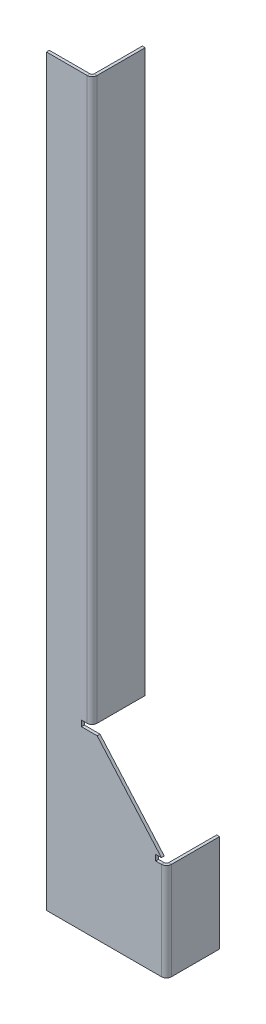
ISO-10303-21;
HEADER;
FILE_DESCRIPTION(('STEP AP214'),'2;1');
FILE_NAME('part.step','',(''),(''),'','','');
FILE_SCHEMA(('AUTOMOTIVE_DESIGN { 1 0 10303 214 1 1 1 1 }'));
ENDSEC;
DATA;
#1=APPLICATION_CONTEXT('core data for automotive mechanical design processes');
#2=APPLICATION_PROTOCOL_DEFINITION('international standard','automotive_design',2000,#1);
#3=PRODUCT_CONTEXT('',#1,'mechanical');
#4=PRODUCT('Part','Part','',(#3));
#5=PRODUCT_RELATED_PRODUCT_CATEGORY('part','',(#4));
#6=PRODUCT_DEFINITION_FORMATION('','',#4);
#7=PRODUCT_DEFINITION_CONTEXT('part definition',#1,'design');
#8=PRODUCT_DEFINITION('design','',#6,#7);
#9=PRODUCT_DEFINITION_SHAPE('','',#8);
#10=(LENGTH_UNIT() NAMED_UNIT(*) SI_UNIT(.MILLI.,.METRE.));
#11=(NAMED_UNIT(*) PLANE_ANGLE_UNIT() SI_UNIT($,.RADIAN.));
#12=(NAMED_UNIT(*) SI_UNIT($,.STERADIAN.) SOLID_ANGLE_UNIT());
#13=UNCERTAINTY_MEASURE_WITH_UNIT(LENGTH_MEASURE(1.E-05),#10,'distance_accuracy_value','');
#14=(GEOMETRIC_REPRESENTATION_CONTEXT(3) GLOBAL_UNCERTAINTY_ASSIGNED_CONTEXT((#13)) GLOBAL_UNIT_ASSIGNED_CONTEXT((#10,
#11,#12)) REPRESENTATION_CONTEXT('',''));
#15=CARTESIAN_POINT('',(0.,0.,0.));
#16=DIRECTION('',(0.,0.,1.));
#17=DIRECTION('',(1.,0.,0.));
#18=AXIS2_PLACEMENT_3D('',#15,#16,#17);
#19=CARTESIAN_POINT('',(113.,91.7,-2.7));
#20=DIRECTION('',(0.752576694706878,0.658504607868518,0.));
#21=DIRECTION('',(-0.658504607868518,0.752576694706878,0.));
#22=AXIS2_PLACEMENT_3D('',#19,#20,#21);
#23=PLANE('',#22);
#24=DIRECTION('',(-0.658504607868518,0.752576694706878,0.));
#25=VECTOR('',#24,1.);
#26=CARTESIAN_POINT('',(113.,91.7,-2.7));
#27=LINE('',#26,#25);
#28=CARTESIAN_POINT('',(108.275,97.1,-2.69999999999999));
#29=VERTEX_POINT('',#28);
#30=CARTESIAN_POINT('',(47.725,166.3,-2.7));
#31=VERTEX_POINT('',#30);
#32=EDGE_CURVE('E377',#29,#31,#27,.T.);
#33=ORIENTED_EDGE('',*,*,#32,.T.);
#34=DIRECTION('',(0.,0.,1.));
#35=VECTOR('',#34,1.);
#36=CARTESIAN_POINT('',(47.7249999999999,166.3,-2.7));
#37=LINE('',#36,#35);
#38=CARTESIAN_POINT('',(47.725,166.3,0.));
#39=VERTEX_POINT('',#38);
#40=EDGE_CURVE('E343',#31,#39,#37,.T.);
#41=ORIENTED_EDGE('',*,*,#40,.T.);
#42=DIRECTION('',(-0.658504607868518,0.752576694706878,0.));
#43=VECTOR('',#42,1.);
#44=CARTESIAN_POINT('',(113.,91.7,0.));
#45=LINE('',#44,#43);
#46=CARTESIAN_POINT('',(108.275,97.1,0.));
#47=VERTEX_POINT('',#46);
#48=EDGE_CURVE('E371',#47,#39,#45,.T.);
#49=ORIENTED_EDGE('',*,*,#48,.F.);
#50=DIRECTION('',(0.,0.,1.));
#51=VECTOR('',#50,1.);
#52=CARTESIAN_POINT('',(108.275,97.1,-2.69999999999999));
#53=LINE('',#52,#51);
#54=EDGE_CURVE('E362',#29,#47,#53,.T.);
#55=ORIENTED_EDGE('',*,*,#54,.F.);
#56=EDGE_LOOP('',(#33,#41,#49,#55));
#57=FACE_BOUND('',#56,.T.);
#58=ADVANCED_FACE('F81',(#57),#23,.T.);
#59=CARTESIAN_POINT('',(0.,0.,-2.7));
#60=DIRECTION('',(0.,0.,1.));
#61=DIRECTION('',(1.,0.,0.));
#62=AXIS2_PLACEMENT_3D('',#59,#60,#61);
#63=PLANE('',#62);
#64=DIRECTION('',(-1.,0.,0.));
#65=VECTOR('',#64,1.);
#66=CARTESIAN_POINT('',(47.7249999999999,166.3,-2.7));
#67=LINE('',#66,#65);
#68=CARTESIAN_POINT('',(32.9,166.3,-2.7));
#69=VERTEX_POINT('',#68);
#70=EDGE_CURVE('E339',#31,#69,#67,.T.);
#71=ORIENTED_EDGE('',*,*,#70,.F.);
#72=ORIENTED_EDGE('',*,*,#32,.F.);
#73=DIRECTION('',(1.,0.,0.));
#74=VECTOR('',#73,1.);
#75=CARTESIAN_POINT('',(102.9,97.1,-2.69999999999999));
#76=LINE('',#75,#74);
#77=CARTESIAN_POINT('',(102.9,97.1,-2.69999999999999));
#78=VERTEX_POINT('',#77);
#79=EDGE_CURVE('E360',#78,#29,#76,.T.);
#80=ORIENTED_EDGE('',*,*,#79,.F.);
#81=DIRECTION('',(0.,1.,0.));
#82=VECTOR('',#81,1.);
#83=CARTESIAN_POINT('',(102.9,91.7,-2.69999999999999));
#84=LINE('',#83,#82);
#85=CARTESIAN_POINT('',(102.9,91.7,-2.69999999999999));
#86=VERTEX_POINT('',#85);
#87=EDGE_CURVE('E356',#86,#78,#84,.T.);
#88=ORIENTED_EDGE('',*,*,#87,.F.);
#89=DIRECTION('',(-1.,0.,0.));
#90=VECTOR('',#89,1.);
#91=CARTESIAN_POINT('',(108.3,91.7,-2.69999999999999));
#92=LINE('',#91,#90);
#93=CARTESIAN_POINT('',(108.3,91.7,-2.69999999999999));
#94=VERTEX_POINT('',#93);
#95=EDGE_CURVE('E352',#94,#86,#92,.T.);
#96=ORIENTED_EDGE('',*,*,#95,.F.);
#97=DIRECTION('',(0.,-1.,0.));
#98=VECTOR('',#97,1.);
#99=CARTESIAN_POINT('',(108.3,0.,-2.69999999999999));
#100=LINE('',#99,#98);
#101=CARTESIAN_POINT('',(108.3,0.,-2.69999999999999));
#102=VERTEX_POINT('',#101);
#103=EDGE_CURVE('E329',#102,#94,#100,.F.);
#104=ORIENTED_EDGE('',*,*,#103,.F.);
#105=DIRECTION('',(1.,0.,0.));
#106=VECTOR('',#105,1.);
#107=CARTESIAN_POINT('',(0.,0.,-2.7));
#108=LINE('',#107,#106);
#109=CARTESIAN_POINT('',(0.,0.,-2.7));
#110=VERTEX_POINT('',#109);
#111=EDGE_CURVE('E374',#110,#102,#108,.T.);
#112=ORIENTED_EDGE('',*,*,#111,.F.);
#113=DIRECTION('',(0.,-1.,0.));
#114=VECTOR('',#113,1.);
#115=CARTESIAN_POINT('',(0.,700.,-2.7));
#116=LINE('',#115,#114);
#117=CARTESIAN_POINT('',(0.,700.,-2.7));
#118=VERTEX_POINT('',#117);
#119=EDGE_CURVE('E370',#118,#110,#116,.T.);
#120=ORIENTED_EDGE('',*,*,#119,.F.);
#121=DIRECTION('',(-1.,0.,0.));
#122=VECTOR('',#121,1.);
#123=CARTESIAN_POINT('',(43.,700.,-2.7));
#124=LINE('',#123,#122);
#125=CARTESIAN_POINT('',(38.3,700.,-2.7));
#126=VERTEX_POINT('',#125);
#127=EDGE_CURVE('E368',#126,#118,#124,.T.);
#128=ORIENTED_EDGE('',*,*,#127,.F.);
#129=DIRECTION('',(0.,-1.,0.));
#130=VECTOR('',#129,1.);
#131=CARTESIAN_POINT('',(38.3,171.7,-2.7));
#132=LINE('',#131,#130);
#133=CARTESIAN_POINT('',(38.3,171.7,-2.7));
#134=VERTEX_POINT('',#133);
#135=EDGE_CURVE('E274',#134,#126,#132,.F.);
#136=ORIENTED_EDGE('',*,*,#135,.F.);
#137=DIRECTION('',(1.,0.,0.));
#138=VECTOR('',#137,1.);
#139=CARTESIAN_POINT('',(32.9,171.7,-2.7));
#140=LINE('',#139,#138);
#141=CARTESIAN_POINT('',(32.9,171.7,-2.7));
#142=VERTEX_POINT('',#141);
#143=EDGE_CURVE('E101',#142,#134,#140,.T.);
#144=ORIENTED_EDGE('',*,*,#143,.F.);
#145=DIRECTION('',(0.,1.,0.));
#146=VECTOR('',#145,1.);
#147=CARTESIAN_POINT('',(32.9,166.3,-2.7));
#148=LINE('',#147,#146);
#149=EDGE_CURVE('E96',#69,#142,#148,.T.);
#150=ORIENTED_EDGE('',*,*,#149,.F.);
#151=EDGE_LOOP('',(#71,#72,#80,#88,#96,#104,#112,#120,#128,#136,#144,#150));
#152=FACE_BOUND('',#151,.T.);
#153=ADVANCED_FACE('F418',(#152),#63,.F.);
#154=CARTESIAN_POINT('',(0.,0.,0.));
#155=DIRECTION('',(0.,0.,1.));
#156=DIRECTION('',(1.,0.,0.));
#157=AXIS2_PLACEMENT_3D('',#154,#155,#156);
#158=PLANE('',#157);
#159=ORIENTED_EDGE('',*,*,#48,.T.);
#160=DIRECTION('',(-1.,0.,0.));
#161=VECTOR('',#160,1.);
#162=CARTESIAN_POINT('',(3.11349222588809E-13,166.3,0.));
#163=LINE('',#162,#161);
#164=CARTESIAN_POINT('',(32.9,166.3,0.));
#165=VERTEX_POINT('',#164);
#166=EDGE_CURVE('E13',#39,#165,#163,.T.);
#167=ORIENTED_EDGE('',*,*,#166,.T.);
#168=DIRECTION('',(0.,1.,0.));
#169=VECTOR('',#168,1.);
#170=CARTESIAN_POINT('',(32.9,0.,0.));
#171=LINE('',#170,#169);
#172=CARTESIAN_POINT('',(32.9,171.7,0.));
#173=VERTEX_POINT('',#172);
#174=EDGE_CURVE('E89',#165,#173,#171,.T.);
#175=ORIENTED_EDGE('',*,*,#174,.T.);
#176=DIRECTION('',(1.,0.,0.));
#177=VECTOR('',#176,1.);
#178=CARTESIAN_POINT('',(0.,171.7,0.));
#179=LINE('',#178,#177);
#180=CARTESIAN_POINT('',(38.3,171.7,0.));
#181=VERTEX_POINT('',#180);
#182=EDGE_CURVE('E403',#173,#181,#179,.T.);
#183=ORIENTED_EDGE('',*,*,#182,.T.);
#184=DIRECTION('',(0.,-1.,0.));
#185=VECTOR('',#184,1.);
#186=CARTESIAN_POINT('',(38.3,171.7,0.));
#187=LINE('',#186,#185);
#188=CARTESIAN_POINT('',(38.3,700.,0.));
#189=VERTEX_POINT('',#188);
#190=EDGE_CURVE('E261',#181,#189,#187,.F.);
#191=ORIENTED_EDGE('',*,*,#190,.T.);
#192=DIRECTION('',(-1.,0.,0.));
#193=VECTOR('',#192,1.);
#194=CARTESIAN_POINT('',(43.,700.,0.));
#195=LINE('',#194,#193);
#196=CARTESIAN_POINT('',(0.,700.,0.));
#197=VERTEX_POINT('',#196);
#198=EDGE_CURVE('E355',#189,#197,#195,.T.);
#199=ORIENTED_EDGE('',*,*,#198,.T.);
#200=DIRECTION('',(0.,-1.,0.));
#201=VECTOR('',#200,1.);
#202=CARTESIAN_POINT('',(0.,700.,0.));
#203=LINE('',#202,#201);
#204=CARTESIAN_POINT('',(0.,0.,0.));
#205=VERTEX_POINT('',#204);
#206=EDGE_CURVE('E382',#197,#205,#203,.T.);
#207=ORIENTED_EDGE('',*,*,#206,.T.);
#208=DIRECTION('',(1.,0.,0.));
#209=VECTOR('',#208,1.);
#210=CARTESIAN_POINT('',(0.,0.,0.));
#211=LINE('',#210,#209);
#212=CARTESIAN_POINT('',(108.3,0.,0.));
#213=VERTEX_POINT('',#212);
#214=EDGE_CURVE('E385',#205,#213,#211,.T.);
#215=ORIENTED_EDGE('',*,*,#214,.T.);
#216=DIRECTION('',(0.,-1.,0.));
#217=VECTOR('',#216,1.);
#218=CARTESIAN_POINT('',(108.3,0.,0.));
#219=LINE('',#218,#217);
#220=CARTESIAN_POINT('',(108.3,91.7,0.));
#221=VERTEX_POINT('',#220);
#222=EDGE_CURVE('E316',#213,#221,#219,.F.);
#223=ORIENTED_EDGE('',*,*,#222,.T.);
#224=DIRECTION('',(-1.,0.,0.));
#225=VECTOR('',#224,1.);
#226=CARTESIAN_POINT('',(0.,91.7,0.));
#227=LINE('',#226,#225);
#228=CARTESIAN_POINT('',(102.9,91.7,0.));
#229=VERTEX_POINT('',#228);
#230=EDGE_CURVE('E400',#221,#229,#227,.T.);
#231=ORIENTED_EDGE('',*,*,#230,.T.);
#232=DIRECTION('',(0.,1.,0.));
#233=VECTOR('',#232,1.);
#234=CARTESIAN_POINT('',(102.9,0.,0.));
#235=LINE('',#234,#233);
#236=CARTESIAN_POINT('',(102.9,97.1,0.));
#237=VERTEX_POINT('',#236);
#238=EDGE_CURVE('E397',#229,#237,#235,.T.);
#239=ORIENTED_EDGE('',*,*,#238,.T.);
#240=DIRECTION('',(1.,0.,0.));
#241=VECTOR('',#240,1.);
#242=CARTESIAN_POINT('',(0.,97.1,0.));
#243=LINE('',#242,#241);
#244=EDGE_CURVE('E392',#237,#47,#243,.T.);
#245=ORIENTED_EDGE('',*,*,#244,.T.);
#246=EDGE_LOOP('',(#159,#167,#175,#183,#191,#199,#207,#215,#223,#231,#239,#245));
#247=FACE_BOUND('',#246,.T.);
#248=ADVANCED_FACE('F408',(#247),#158,.T.);
#249=CARTESIAN_POINT('',(0.,0.,-2.7));
#250=DIRECTION('',(0.,-1.,0.));
#251=DIRECTION('',(0.,0.,-1.));
#252=AXIS2_PLACEMENT_3D('',#249,#250,#251);
#253=PLANE('',#252);
#254=ORIENTED_EDGE('',*,*,#111,.T.);
#255=DIRECTION('',(0.,0.,1.));
#256=VECTOR('',#255,1.);
#257=CARTESIAN_POINT('',(108.3,0.,-2.69999999999999));
#258=LINE('',#257,#256);
#259=EDGE_CURVE('E323',#102,#213,#258,.T.);
#260=ORIENTED_EDGE('',*,*,#259,.T.);
#261=ORIENTED_EDGE('',*,*,#214,.F.);
#262=DIRECTION('',(0.,0.,1.));
#263=VECTOR('',#262,1.);
#264=CARTESIAN_POINT('',(0.,0.,-2.7));
#265=LINE('',#264,#263);
#266=EDGE_CURVE('E390',#110,#205,#265,.T.);
#267=ORIENTED_EDGE('',*,*,#266,.F.);
#268=EDGE_LOOP('',(#254,#260,#261,#267));
#269=FACE_BOUND('',#268,.T.);
#270=ADVANCED_FACE('F439',(#269),#253,.T.);
#271=CARTESIAN_POINT('',(0.,700.,-2.7));
#272=DIRECTION('',(-1.,0.,0.));
#273=DIRECTION('',(0.,-1.,0.));
#274=AXIS2_PLACEMENT_3D('',#271,#272,#273);
#275=PLANE('',#274);
#276=ORIENTED_EDGE('',*,*,#206,.F.);
#277=DIRECTION('',(0.,0.,1.));
#278=VECTOR('',#277,1.);
#279=CARTESIAN_POINT('',(0.,700.,-2.7));
#280=LINE('',#279,#278);
#281=EDGE_CURVE('E380',#118,#197,#280,.T.);
#282=ORIENTED_EDGE('',*,*,#281,.F.);
#283=ORIENTED_EDGE('',*,*,#119,.T.);
#284=ORIENTED_EDGE('',*,*,#266,.T.);
#285=EDGE_LOOP('',(#276,#282,#283,#284));
#286=FACE_BOUND('',#285,.T.);
#287=ADVANCED_FACE('F443',(#286),#275,.T.);
#288=CARTESIAN_POINT('',(43.,700.,-2.7));
#289=DIRECTION('',(0.,1.,0.));
#290=DIRECTION('',(0.,0.,1.));
#291=AXIS2_PLACEMENT_3D('',#288,#289,#290);
#292=PLANE('',#291);
#293=DIRECTION('',(0.,0.,1.));
#294=VECTOR('',#293,1.);
#295=CARTESIAN_POINT('',(38.3,700.,-2.7));
#296=LINE('',#295,#294);
#297=EDGE_CURVE('E278',#126,#189,#296,.T.);
#298=ORIENTED_EDGE('',*,*,#297,.F.);
#299=ORIENTED_EDGE('',*,*,#127,.T.);
#300=ORIENTED_EDGE('',*,*,#281,.T.);
#301=ORIENTED_EDGE('',*,*,#198,.F.);
#302=EDGE_LOOP('',(#298,#299,#300,#301));
#303=FACE_BOUND('',#302,.T.);
#304=ADVANCED_FACE('F83',(#303),#292,.T.);
#305=CARTESIAN_POINT('',(108.3,91.7,-2.69999999999999));
#306=DIRECTION('',(0.,1.,0.));
#307=DIRECTION('',(0.,0.,1.));
#308=AXIS2_PLACEMENT_3D('',#305,#306,#307);
#309=PLANE('',#308);
#310=ORIENTED_EDGE('',*,*,#230,.F.);
#311=DIRECTION('',(0.,0.,1.));
#312=VECTOR('',#311,1.);
#313=CARTESIAN_POINT('',(108.3,91.7,-2.69999999999999));
#314=LINE('',#313,#312);
#315=EDGE_CURVE('E333',#94,#221,#314,.T.);
#316=ORIENTED_EDGE('',*,*,#315,.F.);
#317=ORIENTED_EDGE('',*,*,#95,.T.);
#318=DIRECTION('',(0.,0.,1.));
#319=VECTOR('',#318,1.);
#320=CARTESIAN_POINT('',(102.9,91.7,-2.69999999999999));
#321=LINE('',#320,#319);
#322=EDGE_CURVE('E359',#86,#229,#321,.T.);
#323=ORIENTED_EDGE('',*,*,#322,.T.);
#324=EDGE_LOOP('',(#310,#316,#317,#323));
#325=FACE_BOUND('',#324,.T.);
#326=ADVANCED_FACE('F429',(#325),#309,.T.);
#327=CARTESIAN_POINT('',(102.9,91.7,-2.69999999999999));
#328=DIRECTION('',(1.,0.,0.));
#329=DIRECTION('',(0.,0.,-1.));
#330=AXIS2_PLACEMENT_3D('',#327,#328,#329);
#331=PLANE('',#330);
#332=ORIENTED_EDGE('',*,*,#238,.F.);
#333=ORIENTED_EDGE('',*,*,#322,.F.);
#334=ORIENTED_EDGE('',*,*,#87,.T.);
#335=DIRECTION('',(0.,0.,1.));
#336=VECTOR('',#335,1.);
#337=CARTESIAN_POINT('',(102.9,97.1,-2.69999999999999));
#338=LINE('',#337,#336);
#339=EDGE_CURVE('E342',#78,#237,#338,.T.);
#340=ORIENTED_EDGE('',*,*,#339,.T.);
#341=EDGE_LOOP('',(#332,#333,#334,#340));
#342=FACE_BOUND('',#341,.T.);
#343=ADVANCED_FACE('F427',(#342),#331,.T.);
#344=CARTESIAN_POINT('',(102.9,97.1,-2.69999999999999));
#345=DIRECTION('',(0.,-1.,0.));
#346=DIRECTION('',(0.,0.,-1.));
#347=AXIS2_PLACEMENT_3D('',#344,#345,#346);
#348=PLANE('',#347);
#349=ORIENTED_EDGE('',*,*,#244,.F.);
#350=ORIENTED_EDGE('',*,*,#339,.F.);
#351=ORIENTED_EDGE('',*,*,#79,.T.);
#352=ORIENTED_EDGE('',*,*,#54,.T.);
#353=EDGE_LOOP('',(#349,#350,#351,#352));
#354=FACE_BOUND('',#353,.T.);
#355=ADVANCED_FACE('F424',(#354),#348,.T.);
#356=CARTESIAN_POINT('',(47.7249999999999,166.3,-2.7));
#357=DIRECTION('',(0.,1.,0.));
#358=DIRECTION('',(-1.,0.,0.));
#359=AXIS2_PLACEMENT_3D('',#356,#357,#358);
#360=PLANE('',#359);
#361=ORIENTED_EDGE('',*,*,#166,.F.);
#362=ORIENTED_EDGE('',*,*,#40,.F.);
#363=ORIENTED_EDGE('',*,*,#70,.T.);
#364=DIRECTION('',(0.,0.,1.));
#365=VECTOR('',#364,1.);
#366=CARTESIAN_POINT('',(32.9,166.3,-2.7));
#367=LINE('',#366,#365);
#368=EDGE_CURVE('E345',#69,#165,#367,.T.);
#369=ORIENTED_EDGE('',*,*,#368,.T.);
#370=EDGE_LOOP('',(#361,#362,#363,#369));
#371=FACE_BOUND('',#370,.T.);
#372=ADVANCED_FACE('F416',(#371),#360,.T.);
#373=CARTESIAN_POINT('',(32.9,166.3,-2.7));
#374=DIRECTION('',(1.,0.,0.));
#375=DIRECTION('',(0.,0.,-1.));
#376=AXIS2_PLACEMENT_3D('',#373,#374,#375);
#377=PLANE('',#376);
#378=ORIENTED_EDGE('',*,*,#174,.F.);
#379=ORIENTED_EDGE('',*,*,#368,.F.);
#380=ORIENTED_EDGE('',*,*,#149,.T.);
#381=DIRECTION('',(0.,0.,1.));
#382=VECTOR('',#381,1.);
#383=CARTESIAN_POINT('',(32.9,171.7,-2.7));
#384=LINE('',#383,#382);
#385=EDGE_CURVE('E336',#142,#173,#384,.T.);
#386=ORIENTED_EDGE('',*,*,#385,.T.);
#387=EDGE_LOOP('',(#378,#379,#380,#386));
#388=FACE_BOUND('',#387,.T.);
#389=ADVANCED_FACE('F413',(#388),#377,.T.);
#390=CARTESIAN_POINT('',(32.9,171.7,-2.7));
#391=DIRECTION('',(0.,-1.,0.));
#392=DIRECTION('',(0.,0.,-1.));
#393=AXIS2_PLACEMENT_3D('',#390,#391,#392);
#394=PLANE('',#393);
#395=ORIENTED_EDGE('',*,*,#182,.F.);
#396=ORIENTED_EDGE('',*,*,#385,.F.);
#397=ORIENTED_EDGE('',*,*,#143,.T.);
#398=DIRECTION('',(0.,0.,1.));
#399=VECTOR('',#398,1.);
#400=CARTESIAN_POINT('',(38.3,171.7,-2.7));
#401=LINE('',#400,#399);
#402=EDGE_CURVE('E268',#134,#181,#401,.T.);
#403=ORIENTED_EDGE('',*,*,#402,.T.);
#404=EDGE_LOOP('',(#395,#396,#397,#403));
#405=FACE_BOUND('',#404,.T.);
#406=ADVANCED_FACE('F412',(#405),#394,.T.);
#407=CARTESIAN_POINT('',(108.3,91.7,-4.69999999999999));
#408=DIRECTION('',(0.,1.,0.));
#409=DIRECTION('',(0.,0.,1.));
#410=AXIS2_PLACEMENT_3D('',#407,#408,#409);
#411=PLANE('',#410);
#412=DIRECTION('',(1.,0.,0.));
#413=VECTOR('',#412,1.);
#414=CARTESIAN_POINT('',(113.,91.7,-4.69999999999998));
#415=LINE('',#414,#413);
#416=CARTESIAN_POINT('',(110.3,91.7,-4.69999999999998));
#417=VERTEX_POINT('',#416);
#418=CARTESIAN_POINT('',(113.,91.7,-4.69999999999997));
#419=VERTEX_POINT('',#418);
#420=EDGE_CURVE('E281',#417,#419,#415,.T.);
#421=ORIENTED_EDGE('',*,*,#420,.F.);
#422=CARTESIAN_POINT('',(108.3,91.7,-4.69999999999999));
#423=DIRECTION('',(0.,-1.,0.));
#424=DIRECTION('',(0.,0.,-1.));
#425=AXIS2_PLACEMENT_3D('',#422,#423,#424);
#426=CIRCLE('',#425,2.);
#427=EDGE_CURVE('E326',#94,#417,#426,.F.);
#428=ORIENTED_EDGE('',*,*,#427,.F.);
#429=ORIENTED_EDGE('',*,*,#315,.T.);
#430=CARTESIAN_POINT('',(108.3,91.7,-4.69999999999999));
#431=DIRECTION('',(0.,-1.,0.));
#432=DIRECTION('',(0.,0.,-1.));
#433=AXIS2_PLACEMENT_3D('',#430,#431,#432);
#434=CIRCLE('',#433,4.7);
#435=EDGE_CURVE('E319',#221,#419,#434,.F.);
#436=ORIENTED_EDGE('',*,*,#435,.T.);
#437=EDGE_LOOP('',(#421,#428,#429,#436));
#438=FACE_BOUND('',#437,.T.);
#439=ADVANCED_FACE('F502',(#438),#411,.T.);
#440=CARTESIAN_POINT('',(108.3,0.,-4.69999999999999));
#441=DIRECTION('',(0.,1.,0.));
#442=DIRECTION('',(0.,0.,1.));
#443=AXIS2_PLACEMENT_3D('',#440,#441,#442);
#444=PLANE('',#443);
#445=CARTESIAN_POINT('',(108.3,0.,-4.69999999999999));
#446=DIRECTION('',(0.,-1.,0.));
#447=DIRECTION('',(0.,0.,-1.));
#448=AXIS2_PLACEMENT_3D('',#445,#446,#447);
#449=CIRCLE('',#448,2.);
#450=CARTESIAN_POINT('',(110.3,0.,-4.69999999999998));
#451=VERTEX_POINT('',#450);
#452=EDGE_CURVE('E286',#451,#102,#449,.T.);
#453=ORIENTED_EDGE('',*,*,#452,.F.);
#454=DIRECTION('',(1.,0.,0.));
#455=VECTOR('',#454,1.);
#456=CARTESIAN_POINT('',(110.3,0.,-4.69999999999998));
#457=LINE('',#456,#455);
#458=CARTESIAN_POINT('',(113.,0.,-4.69999999999997));
#459=VERTEX_POINT('',#458);
#460=EDGE_CURVE('E309',#451,#459,#457,.T.);
#461=ORIENTED_EDGE('',*,*,#460,.T.);
#462=CARTESIAN_POINT('',(108.3,0.,-4.69999999999999));
#463=DIRECTION('',(0.,-1.,0.));
#464=DIRECTION('',(0.,0.,-1.));
#465=AXIS2_PLACEMENT_3D('',#462,#463,#464);
#466=CIRCLE('',#465,4.7);
#467=EDGE_CURVE('E320',#459,#213,#466,.T.);
#468=ORIENTED_EDGE('',*,*,#467,.T.);
#469=ORIENTED_EDGE('',*,*,#259,.F.);
#470=EDGE_LOOP('',(#453,#461,#468,#469));
#471=FACE_BOUND('',#470,.T.);
#472=ADVANCED_FACE('F503',(#471),#444,.F.);
#473=CARTESIAN_POINT('',(108.3,0.,-4.69999999999999));
#474=DIRECTION('',(0.,-1.,0.));
#475=DIRECTION('',(1.,0.,0.));
#476=AXIS2_PLACEMENT_3D('',#473,#474,#475);
#477=CYLINDRICAL_SURFACE('',#476,4.7);
#478=ORIENTED_EDGE('',*,*,#222,.F.);
#479=ORIENTED_EDGE('',*,*,#467,.F.);
#480=DIRECTION('',(0.,-1.,0.));
#481=VECTOR('',#480,1.);
#482=CARTESIAN_POINT('',(113.,0.,-4.69999999999997));
#483=LINE('',#482,#481);
#484=EDGE_CURVE('E306',#419,#459,#483,.T.);
#485=ORIENTED_EDGE('',*,*,#484,.F.);
#486=ORIENTED_EDGE('',*,*,#435,.F.);
#487=EDGE_LOOP('',(#478,#479,#485,#486));
#488=FACE_BOUND('',#487,.T.);
#489=ADVANCED_FACE('F506',(#488),#477,.T.);
#490=CARTESIAN_POINT('',(108.3,0.,-4.69999999999999));
#491=DIRECTION('',(0.,-1.,0.));
#492=DIRECTION('',(1.,0.,0.));
#493=AXIS2_PLACEMENT_3D('',#490,#491,#492);
#494=CYLINDRICAL_SURFACE('',#493,2.);
#495=ORIENTED_EDGE('',*,*,#103,.T.);
#496=ORIENTED_EDGE('',*,*,#427,.T.);
#497=DIRECTION('',(0.,1.,0.));
#498=VECTOR('',#497,1.);
#499=CARTESIAN_POINT('',(110.3,91.7,-4.69999999999998));
#500=LINE('',#499,#498);
#501=EDGE_CURVE('E312',#417,#451,#500,.F.);
#502=ORIENTED_EDGE('',*,*,#501,.T.);
#503=ORIENTED_EDGE('',*,*,#452,.T.);
#504=EDGE_LOOP('',(#495,#496,#502,#503));
#505=FACE_BOUND('',#504,.T.);
#506=ADVANCED_FACE('F511',(#505),#494,.F.);
#507=CARTESIAN_POINT('',(113.,0.,-2.69999999999999));
#508=DIRECTION('',(0.,-1.,0.));
#509=DIRECTION('',(0.,0.,-1.));
#510=AXIS2_PLACEMENT_3D('',#507,#508,#509);
#511=PLANE('',#510);
#512=DIRECTION('',(0.,0.,1.));
#513=VECTOR('',#512,1.);
#514=CARTESIAN_POINT('',(113.,0.,-2.69999999999999));
#515=LINE('',#514,#513);
#516=CARTESIAN_POINT('',(113.,0.,-50.));
#517=VERTEX_POINT('',#516);
#518=EDGE_CURVE('E290',#517,#459,#515,.T.);
#519=ORIENTED_EDGE('',*,*,#518,.T.);
#520=ORIENTED_EDGE('',*,*,#460,.F.);
#521=DIRECTION('',(0.,0.,-1.));
#522=VECTOR('',#521,1.);
#523=CARTESIAN_POINT('',(110.3,0.,3.97849477111974E-13));
#524=LINE('',#523,#522);
#525=CARTESIAN_POINT('',(110.3,0.,-50.));
#526=VERTEX_POINT('',#525);
#527=EDGE_CURVE('E298',#526,#451,#524,.F.);
#528=ORIENTED_EDGE('',*,*,#527,.F.);
#529=DIRECTION('',(-1.,0.,0.));
#530=VECTOR('',#529,1.);
#531=CARTESIAN_POINT('',(113.,0.,-50.));
#532=LINE('',#531,#530);
#533=EDGE_CURVE('E284',#517,#526,#532,.T.);
#534=ORIENTED_EDGE('',*,*,#533,.F.);
#535=EDGE_LOOP('',(#519,#520,#528,#534));
#536=FACE_BOUND('',#535,.T.);
#537=ADVANCED_FACE('F514',(#536),#511,.T.);
#538=CARTESIAN_POINT('',(113.,91.7,-50.));
#539=DIRECTION('',(0.,1.,0.));
#540=DIRECTION('',(0.,0.,1.));
#541=AXIS2_PLACEMENT_3D('',#538,#539,#540);
#542=PLANE('',#541);
#543=DIRECTION('',(0.,0.,1.));
#544=VECTOR('',#543,1.);
#545=CARTESIAN_POINT('',(110.3,91.7,3.97849477111974E-13));
#546=LINE('',#545,#544);
#547=CARTESIAN_POINT('',(110.3,91.7,-50.));
#548=VERTEX_POINT('',#547);
#549=EDGE_CURVE('E304',#417,#548,#546,.F.);
#550=ORIENTED_EDGE('',*,*,#549,.F.);
#551=ORIENTED_EDGE('',*,*,#420,.T.);
#552=DIRECTION('',(0.,0.,-1.));
#553=VECTOR('',#552,1.);
#554=CARTESIAN_POINT('',(113.,91.7,-50.));
#555=LINE('',#554,#553);
#556=CARTESIAN_POINT('',(113.,91.7,-50.));
#557=VERTEX_POINT('',#556);
#558=EDGE_CURVE('E296',#419,#557,#555,.T.);
#559=ORIENTED_EDGE('',*,*,#558,.T.);
#560=DIRECTION('',(-1.,0.,0.));
#561=VECTOR('',#560,1.);
#562=CARTESIAN_POINT('',(113.,91.7,-50.));
#563=LINE('',#562,#561);
#564=EDGE_CURVE('E287',#557,#548,#563,.T.);
#565=ORIENTED_EDGE('',*,*,#564,.T.);
#566=EDGE_LOOP('',(#550,#551,#559,#565));
#567=FACE_BOUND('',#566,.T.);
#568=ADVANCED_FACE('F518',(#567),#542,.T.);
#569=CARTESIAN_POINT('',(113.,0.,4.07276476726851E-13));
#570=DIRECTION('',(1.,0.,0.));
#571=DIRECTION('',(0.,0.,-1.));
#572=AXIS2_PLACEMENT_3D('',#569,#570,#571);
#573=PLANE('',#572);
#574=ORIENTED_EDGE('',*,*,#558,.F.);
#575=ORIENTED_EDGE('',*,*,#484,.T.);
#576=ORIENTED_EDGE('',*,*,#518,.F.);
#577=DIRECTION('',(0.,-1.,0.));
#578=VECTOR('',#577,1.);
#579=CARTESIAN_POINT('',(113.,0.,-50.));
#580=LINE('',#579,#578);
#581=EDGE_CURVE('E293',#557,#517,#580,.T.);
#582=ORIENTED_EDGE('',*,*,#581,.F.);
#583=EDGE_LOOP('',(#574,#575,#576,#582));
#584=FACE_BOUND('',#583,.T.);
#585=ADVANCED_FACE('F521',(#584),#573,.T.);
#586=CARTESIAN_POINT('',(110.3,0.,3.97849477111974E-13));
#587=DIRECTION('',(1.,0.,0.));
#588=DIRECTION('',(0.,0.,-1.));
#589=AXIS2_PLACEMENT_3D('',#586,#587,#588);
#590=PLANE('',#589);
#591=ORIENTED_EDGE('',*,*,#501,.F.);
#592=ORIENTED_EDGE('',*,*,#549,.T.);
#593=DIRECTION('',(0.,1.,0.));
#594=VECTOR('',#593,1.);
#595=CARTESIAN_POINT('',(110.3,0.,-50.));
#596=LINE('',#595,#594);
#597=EDGE_CURVE('E301',#548,#526,#596,.F.);
#598=ORIENTED_EDGE('',*,*,#597,.T.);
#599=ORIENTED_EDGE('',*,*,#527,.T.);
#600=EDGE_LOOP('',(#591,#592,#598,#599));
#601=FACE_BOUND('',#600,.T.);
#602=ADVANCED_FACE('F526',(#601),#590,.F.);
#603=CARTESIAN_POINT('',(113.,0.,-50.));
#604=DIRECTION('',(0.,0.,-1.));
#605=DIRECTION('',(-1.,0.,0.));
#606=AXIS2_PLACEMENT_3D('',#603,#604,#605);
#607=PLANE('',#606);
#608=ORIENTED_EDGE('',*,*,#597,.F.);
#609=ORIENTED_EDGE('',*,*,#564,.F.);
#610=ORIENTED_EDGE('',*,*,#581,.T.);
#611=ORIENTED_EDGE('',*,*,#533,.T.);
#612=EDGE_LOOP('',(#608,#609,#610,#611));
#613=FACE_BOUND('',#612,.T.);
#614=ADVANCED_FACE('F523',(#613),#607,.T.);
#615=CARTESIAN_POINT('',(38.3,700.,-4.7));
#616=DIRECTION('',(0.,1.,0.));
#617=DIRECTION('',(0.,0.,1.));
#618=AXIS2_PLACEMENT_3D('',#615,#616,#617);
#619=PLANE('',#618);
#620=DIRECTION('',(1.,0.,0.));
#621=VECTOR('',#620,1.);
#622=CARTESIAN_POINT('',(43.,700.,-4.69999999999999));
#623=LINE('',#622,#621);
#624=CARTESIAN_POINT('',(40.3,700.,-4.69999999999999));
#625=VERTEX_POINT('',#624);
#626=CARTESIAN_POINT('',(43.,700.,-4.69999999999998));
#627=VERTEX_POINT('',#626);
#628=EDGE_CURVE('E258',#625,#627,#623,.T.);
#629=ORIENTED_EDGE('',*,*,#628,.F.);
#630=CARTESIAN_POINT('',(38.3,700.,-4.7));
#631=DIRECTION('',(0.,-1.,0.));
#632=DIRECTION('',(0.,0.,-1.));
#633=AXIS2_PLACEMENT_3D('',#630,#631,#632);
#634=CIRCLE('',#633,2.);
#635=EDGE_CURVE('E271',#126,#625,#634,.F.);
#636=ORIENTED_EDGE('',*,*,#635,.F.);
#637=ORIENTED_EDGE('',*,*,#297,.T.);
#638=CARTESIAN_POINT('',(38.3,700.,-4.7));
#639=DIRECTION('',(0.,-1.,0.));
#640=DIRECTION('',(0.,0.,-1.));
#641=AXIS2_PLACEMENT_3D('',#638,#639,#640);
#642=CIRCLE('',#641,4.7);
#643=EDGE_CURVE('E264',#189,#627,#642,.F.);
#644=ORIENTED_EDGE('',*,*,#643,.T.);
#645=EDGE_LOOP('',(#629,#636,#637,#644));
#646=FACE_BOUND('',#645,.T.);
#647=ADVANCED_FACE('F451',(#646),#619,.T.);
#648=CARTESIAN_POINT('',(38.3,171.7,-4.7));
#649=DIRECTION('',(0.,1.,0.));
#650=DIRECTION('',(0.,0.,1.));
#651=AXIS2_PLACEMENT_3D('',#648,#649,#650);
#652=PLANE('',#651);
#653=CARTESIAN_POINT('',(38.3,171.7,-4.7));
#654=DIRECTION('',(0.,-1.,0.));
#655=DIRECTION('',(0.,0.,-1.));
#656=AXIS2_PLACEMENT_3D('',#653,#654,#655);
#657=CIRCLE('',#656,2.);
#658=CARTESIAN_POINT('',(40.3,171.7,-4.69999999999999));
#659=VERTEX_POINT('',#658);
#660=EDGE_CURVE('E228',#659,#134,#657,.T.);
#661=ORIENTED_EDGE('',*,*,#660,.F.);
#662=DIRECTION('',(1.,0.,0.));
#663=VECTOR('',#662,1.);
#664=CARTESIAN_POINT('',(40.3,171.7,-4.69999999999999));
#665=LINE('',#664,#663);
#666=CARTESIAN_POINT('',(43.,171.7,-4.69999999999998));
#667=VERTEX_POINT('',#666);
#668=EDGE_CURVE('E253',#659,#667,#665,.T.);
#669=ORIENTED_EDGE('',*,*,#668,.T.);
#670=CARTESIAN_POINT('',(38.3,171.7,-4.7));
#671=DIRECTION('',(0.,-1.,0.));
#672=DIRECTION('',(0.,0.,-1.));
#673=AXIS2_PLACEMENT_3D('',#670,#671,#672);
#674=CIRCLE('',#673,4.7);
#675=EDGE_CURVE('E265',#667,#181,#674,.T.);
#676=ORIENTED_EDGE('',*,*,#675,.T.);
#677=ORIENTED_EDGE('',*,*,#402,.F.);
#678=EDGE_LOOP('',(#661,#669,#676,#677));
#679=FACE_BOUND('',#678,.T.);
#680=ADVANCED_FACE('F537',(#679),#652,.F.);
#681=CARTESIAN_POINT('',(38.3,171.7,-4.7));
#682=DIRECTION('',(0.,-1.,0.));
#683=DIRECTION('',(1.,0.,0.));
#684=AXIS2_PLACEMENT_3D('',#681,#682,#683);
#685=CYLINDRICAL_SURFACE('',#684,4.7);
#686=ORIENTED_EDGE('',*,*,#190,.F.);
#687=ORIENTED_EDGE('',*,*,#675,.F.);
#688=DIRECTION('',(0.,-1.,0.));
#689=VECTOR('',#688,1.);
#690=CARTESIAN_POINT('',(43.,700.,-4.69999999999999));
#691=LINE('',#690,#689);
#692=EDGE_CURVE('E237',#667,#627,#691,.F.);
#693=ORIENTED_EDGE('',*,*,#692,.T.);
#694=ORIENTED_EDGE('',*,*,#643,.F.);
#695=EDGE_LOOP('',(#686,#687,#693,#694));
#696=FACE_BOUND('',#695,.T.);
#697=ADVANCED_FACE('F468',(#696),#685,.T.);
#698=CARTESIAN_POINT('',(38.3,171.7,-4.7));
#699=DIRECTION('',(0.,-1.,0.));
#700=DIRECTION('',(1.,0.,0.));
#701=AXIS2_PLACEMENT_3D('',#698,#699,#700);
#702=CYLINDRICAL_SURFACE('',#701,2.);
#703=ORIENTED_EDGE('',*,*,#135,.T.);
#704=ORIENTED_EDGE('',*,*,#635,.T.);
#705=DIRECTION('',(0.,-1.,0.));
#706=VECTOR('',#705,1.);
#707=CARTESIAN_POINT('',(40.3,700.,-4.7));
#708=LINE('',#707,#706);
#709=EDGE_CURVE('E256',#625,#659,#708,.T.);
#710=ORIENTED_EDGE('',*,*,#709,.T.);
#711=ORIENTED_EDGE('',*,*,#660,.T.);
#712=EDGE_LOOP('',(#703,#704,#710,#711));
#713=FACE_BOUND('',#712,.T.);
#714=ADVANCED_FACE('F454',(#713),#702,.F.);
#715=CARTESIAN_POINT('',(43.,700.,-2.69999999999999));
#716=DIRECTION('',(0.,1.,0.));
#717=DIRECTION('',(0.,0.,1.));
#718=AXIS2_PLACEMENT_3D('',#715,#716,#717);
#719=PLANE('',#718);
#720=DIRECTION('',(0.,0.,-1.));
#721=VECTOR('',#720,1.);
#722=CARTESIAN_POINT('',(40.2999999999999,700.,1.51394048812521E-13));
#723=LINE('',#722,#721);
#724=CARTESIAN_POINT('',(40.3000000000001,700.,-50.));
#725=VERTEX_POINT('',#724);
#726=EDGE_CURVE('E250',#625,#725,#723,.T.);
#727=ORIENTED_EDGE('',*,*,#726,.F.);
#728=ORIENTED_EDGE('',*,*,#628,.T.);
#729=DIRECTION('',(0.,0.,1.));
#730=VECTOR('',#729,1.);
#731=CARTESIAN_POINT('',(43.,700.,-2.69999999999999));
#732=LINE('',#731,#730);
#733=CARTESIAN_POINT('',(43.0000000000001,700.,-50.));
#734=VERTEX_POINT('',#733);
#735=EDGE_CURVE('E242',#627,#734,#732,.F.);
#736=ORIENTED_EDGE('',*,*,#735,.T.);
#737=DIRECTION('',(-1.,0.,0.));
#738=VECTOR('',#737,1.);
#739=CARTESIAN_POINT('',(43.0000000000001,700.,-50.));
#740=LINE('',#739,#738);
#741=EDGE_CURVE('E229',#734,#725,#740,.T.);
#742=ORIENTED_EDGE('',*,*,#741,.T.);
#743=EDGE_LOOP('',(#727,#728,#736,#742));
#744=FACE_BOUND('',#743,.T.);
#745=ADVANCED_FACE('F460',(#744),#719,.T.);
#746=CARTESIAN_POINT('',(43.0000000000001,171.7,-50.));
#747=DIRECTION('',(0.,-1.,0.));
#748=DIRECTION('',(0.,0.,-1.));
#749=AXIS2_PLACEMENT_3D('',#746,#747,#748);
#750=PLANE('',#749);
#751=DIRECTION('',(0.,0.,-1.));
#752=VECTOR('',#751,1.);
#753=CARTESIAN_POINT('',(43.0000000000001,171.7,-50.));
#754=LINE('',#753,#752);
#755=CARTESIAN_POINT('',(43.0000000000001,171.7,-50.));
#756=VERTEX_POINT('',#755);
#757=EDGE_CURVE('E221',#756,#667,#754,.F.);
#758=ORIENTED_EDGE('',*,*,#757,.T.);
#759=ORIENTED_EDGE('',*,*,#668,.F.);
#760=DIRECTION('',(0.,0.,1.));
#761=VECTOR('',#760,1.);
#762=CARTESIAN_POINT('',(40.2999999999999,171.7,1.51394048812521E-13));
#763=LINE('',#762,#761);
#764=CARTESIAN_POINT('',(40.3000000000001,171.7,-50.));
#765=VERTEX_POINT('',#764);
#766=EDGE_CURVE('E223',#765,#659,#763,.T.);
#767=ORIENTED_EDGE('',*,*,#766,.F.);
#768=DIRECTION('',(-1.,0.,0.));
#769=VECTOR('',#768,1.);
#770=CARTESIAN_POINT('',(43.0000000000001,171.7,-50.));
#771=LINE('',#770,#769);
#772=EDGE_CURVE('E217',#756,#765,#771,.T.);
#773=ORIENTED_EDGE('',*,*,#772,.F.);
#774=EDGE_LOOP('',(#758,#759,#767,#773));
#775=FACE_BOUND('',#774,.T.);
#776=ADVANCED_FACE('F219',(#775),#750,.T.);
#777=CARTESIAN_POINT('',(43.,0.,1.60821048427398E-13));
#778=DIRECTION('',(-1.,0.,0.));
#779=DIRECTION('',(0.,0.,1.));
#780=AXIS2_PLACEMENT_3D('',#777,#778,#779);
#781=PLANE('',#780);
#782=ORIENTED_EDGE('',*,*,#692,.F.);
#783=ORIENTED_EDGE('',*,*,#757,.F.);
#784=DIRECTION('',(0.,1.,0.));
#785=VECTOR('',#784,1.);
#786=CARTESIAN_POINT('',(43.0000000000001,700.,-50.));
#787=LINE('',#786,#785);
#788=EDGE_CURVE('E236',#734,#756,#787,.F.);
#789=ORIENTED_EDGE('',*,*,#788,.F.);
#790=ORIENTED_EDGE('',*,*,#735,.F.);
#791=EDGE_LOOP('',(#782,#783,#789,#790));
#792=FACE_BOUND('',#791,.T.);
#793=ADVANCED_FACE('F234',(#792),#781,.F.);
#794=CARTESIAN_POINT('',(40.2999999999999,0.,1.51394048812521E-13));
#795=DIRECTION('',(-1.,0.,0.));
#796=DIRECTION('',(0.,0.,1.));
#797=AXIS2_PLACEMENT_3D('',#794,#795,#796);
#798=PLANE('',#797);
#799=ORIENTED_EDGE('',*,*,#766,.T.);
#800=ORIENTED_EDGE('',*,*,#709,.F.);
#801=ORIENTED_EDGE('',*,*,#726,.T.);
#802=DIRECTION('',(0.,-1.,0.));
#803=VECTOR('',#802,1.);
#804=CARTESIAN_POINT('',(40.3000000000001,0.,-50.));
#805=LINE('',#804,#803);
#806=EDGE_CURVE('E248',#725,#765,#805,.T.);
#807=ORIENTED_EDGE('',*,*,#806,.T.);
#808=EDGE_LOOP('',(#799,#800,#801,#807));
#809=FACE_BOUND('',#808,.T.);
#810=ADVANCED_FACE('F458',(#809),#798,.T.);
#811=CARTESIAN_POINT('',(43.0000000000001,700.,-50.));
#812=DIRECTION('',(0.,0.,-1.));
#813=DIRECTION('',(-1.,0.,0.));
#814=AXIS2_PLACEMENT_3D('',#811,#812,#813);
#815=PLANE('',#814);
#816=ORIENTED_EDGE('',*,*,#806,.F.);
#817=ORIENTED_EDGE('',*,*,#741,.F.);
#818=ORIENTED_EDGE('',*,*,#788,.T.);
#819=ORIENTED_EDGE('',*,*,#772,.T.);
#820=EDGE_LOOP('',(#816,#817,#818,#819));
#821=FACE_BOUND('',#820,.T.);
#822=ADVANCED_FACE('F240',(#821),#815,.T.);
#823=CLOSED_SHELL('',(#58,#153,#248,#270,#287,#304,#326,#343,#355,#372,#389,#406,#439,#472,#489,
#506,#537,#568,#585,#602,#614,#647,#680,#697,#714,#745,#776,#793,#810,#822));
#824=MANIFOLD_SOLID_BREP('B2',#823);
#825=ADVANCED_BREP_SHAPE_REPRESENTATION('',(#18,#824),#14);
#826=SHAPE_DEFINITION_REPRESENTATION(#9,#825);
ENDSEC;
END-ISO-10303-21;
